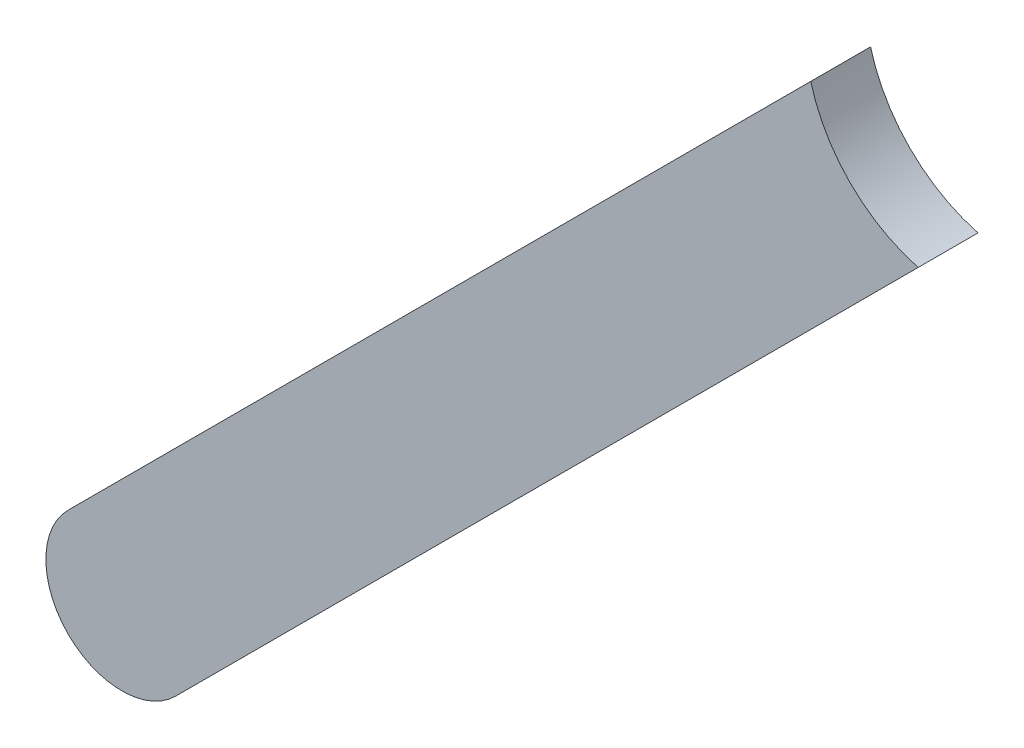
ISO-10303-21;
HEADER;
FILE_DESCRIPTION(('STEP AP214'),'2;1');
FILE_NAME('part.step','',(''),(''),'','','');
FILE_SCHEMA(('AUTOMOTIVE_DESIGN { 1 0 10303 214 1 1 1 1 }'));
ENDSEC;
DATA;
#1=APPLICATION_CONTEXT('core data for automotive mechanical design processes');
#2=APPLICATION_PROTOCOL_DEFINITION('international standard','automotive_design',2000,#1);
#3=PRODUCT_CONTEXT('',#1,'mechanical');
#4=PRODUCT('Part','Part','',(#3));
#5=PRODUCT_RELATED_PRODUCT_CATEGORY('part','',(#4));
#6=PRODUCT_DEFINITION_FORMATION('','',#4);
#7=PRODUCT_DEFINITION_CONTEXT('part definition',#1,'design');
#8=PRODUCT_DEFINITION('design','',#6,#7);
#9=PRODUCT_DEFINITION_SHAPE('','',#8);
#10=(LENGTH_UNIT() NAMED_UNIT(*) SI_UNIT(.MILLI.,.METRE.));
#11=(NAMED_UNIT(*) PLANE_ANGLE_UNIT() SI_UNIT($,.RADIAN.));
#12=(NAMED_UNIT(*) SI_UNIT($,.STERADIAN.) SOLID_ANGLE_UNIT());
#13=UNCERTAINTY_MEASURE_WITH_UNIT(LENGTH_MEASURE(1.E-05),#10,'distance_accuracy_value','');
#14=(GEOMETRIC_REPRESENTATION_CONTEXT(3) GLOBAL_UNCERTAINTY_ASSIGNED_CONTEXT((#13)) GLOBAL_UNIT_ASSIGNED_CONTEXT((#10,
#11,#12)) REPRESENTATION_CONTEXT('',''));
#15=CARTESIAN_POINT('',(0.,0.,0.));
#16=DIRECTION('',(0.,0.,1.));
#17=DIRECTION('',(1.,0.,0.));
#18=AXIS2_PLACEMENT_3D('',#15,#16,#17);
#19=CARTESIAN_POINT('',(87.55560594,87.7043966,0.));
#20=DIRECTION('',(-0.707106781186548,0.707106781186548,0.));
#21=DIRECTION('',(0.707106781186548,0.707106781186548,0.));
#22=AXIS2_PLACEMENT_3D('',#19,#20,#21);
#23=PLANE('',#22);
#24=DIRECTION('',(0.707106781186548,0.707106781186548,0.));
#25=VECTOR('',#24,1.);
#26=CARTESIAN_POINT('',(87.55560594,87.7043966,0.1999996));
#27=LINE('',#26,#25);
#28=CARTESIAN_POINT('',(87.55560594,87.7043966,0.1999996));
#29=VERTEX_POINT('',#28);
#30=CARTESIAN_POINT('',(90.0385192114614,90.1873098714614,0.1999996));
#31=VERTEX_POINT('',#30);
#32=EDGE_CURVE('E11',#29,#31,#27,.T.);
#33=ORIENTED_EDGE('',*,*,#32,.F.);
#34=DIRECTION('',(0.,0.,1.));
#35=VECTOR('',#34,1.);
#36=CARTESIAN_POINT('',(87.55560594,87.7043966,0.));
#37=LINE('',#36,#35);
#38=CARTESIAN_POINT('',(87.55560594,87.7043966,0.));
#39=VERTEX_POINT('',#38);
#40=EDGE_CURVE('E24',#39,#29,#37,.T.);
#41=ORIENTED_EDGE('',*,*,#40,.F.);
#42=DIRECTION('',(0.707106781186548,0.707106781186548,0.));
#43=VECTOR('',#42,1.);
#44=CARTESIAN_POINT('',(87.55560594,87.7043966,0.));
#45=LINE('',#44,#43);
#46=CARTESIAN_POINT('',(90.0385192114614,90.1873098714614,0.));
#47=VERTEX_POINT('',#46);
#48=EDGE_CURVE('E75',#39,#47,#45,.T.);
#49=ORIENTED_EDGE('',*,*,#48,.T.);
#50=DIRECTION('',(0.,0.,1.));
#51=VECTOR('',#50,1.);
#52=CARTESIAN_POINT('',(90.0385192114614,90.1873098714614,0.));
#53=LINE('',#52,#51);
#54=EDGE_CURVE('E37',#47,#31,#53,.T.);
#55=ORIENTED_EDGE('',*,*,#54,.T.);
#56=EDGE_LOOP('',(#33,#41,#49,#55));
#57=FACE_BOUND('',#56,.T.);
#58=ADVANCED_FACE('F17',(#57),#23,.F.);
#59=CARTESIAN_POINT('',(90.17,90.678,0.));
#60=DIRECTION('',(0.,0.,-1.));
#61=DIRECTION('',(1.,0.,0.));
#62=AXIS2_PLACEMENT_3D('',#59,#60,#61);
#63=CYLINDRICAL_SURFACE('',#62,0.508);
#64=DIRECTION('',(0.,0.,1.));
#65=VECTOR('',#64,1.);
#66=CARTESIAN_POINT('',(89.6793098714614,90.5465192114614,0.));
#67=LINE('',#66,#65);
#68=CARTESIAN_POINT('',(89.6793098714614,90.5465192114614,0.));
#69=VERTEX_POINT('',#68);
#70=CARTESIAN_POINT('',(89.6793098714614,90.5465192114614,0.1999996));
#71=VERTEX_POINT('',#70);
#72=EDGE_CURVE('E67',#69,#71,#67,.T.);
#73=ORIENTED_EDGE('',*,*,#72,.T.);
#74=CARTESIAN_POINT('',(90.17,90.678,0.1999996));
#75=DIRECTION('',(0.,0.,1.));
#76=DIRECTION('',(1.,0.,0.));
#77=AXIS2_PLACEMENT_3D('',#74,#75,#76);
#78=CIRCLE('',#77,0.508);
#79=EDGE_CURVE('E82',#71,#31,#78,.T.);
#80=ORIENTED_EDGE('',*,*,#79,.T.);
#81=ORIENTED_EDGE('',*,*,#54,.F.);
#82=CARTESIAN_POINT('',(90.17,90.678,0.));
#83=DIRECTION('',(0.,0.,1.));
#84=DIRECTION('',(1.,0.,0.));
#85=AXIS2_PLACEMENT_3D('',#82,#83,#84);
#86=CIRCLE('',#85,0.508);
#87=EDGE_CURVE('E80',#69,#47,#86,.T.);
#88=ORIENTED_EDGE('',*,*,#87,.F.);
#89=EDGE_LOOP('',(#73,#80,#81,#88));
#90=FACE_BOUND('',#89,.T.);
#91=ADVANCED_FACE('F88',(#90),#63,.F.);
#92=CARTESIAN_POINT('',(89.6793098714614,90.5465192114614,0.));
#93=DIRECTION('',(0.707106781186549,-0.707106781186546,0.));
#94=DIRECTION('',(-0.707106781186546,-0.707106781186549,0.));
#95=AXIS2_PLACEMENT_3D('',#92,#93,#94);
#96=PLANE('',#95);
#97=DIRECTION('',(-0.707106781186546,-0.707106781186549,0.));
#98=VECTOR('',#97,1.);
#99=CARTESIAN_POINT('',(89.99039406,90.8576034,0.1999996));
#100=LINE('',#99,#98);
#101=CARTESIAN_POINT('',(87.1963966,88.06360594,0.1999996));
#102=VERTEX_POINT('',#101);
#103=EDGE_CURVE('E71',#71,#102,#100,.T.);
#104=ORIENTED_EDGE('',*,*,#103,.F.);
#105=ORIENTED_EDGE('',*,*,#72,.F.);
#106=DIRECTION('',(-0.707106781186546,-0.707106781186549,0.));
#107=VECTOR('',#106,1.);
#108=CARTESIAN_POINT('',(89.99039406,90.8576034,0.));
#109=LINE('',#108,#107);
#110=CARTESIAN_POINT('',(87.1963966,88.06360594,0.));
#111=VERTEX_POINT('',#110);
#112=EDGE_CURVE('E63',#69,#111,#109,.T.);
#113=ORIENTED_EDGE('',*,*,#112,.T.);
#114=DIRECTION('',(0.,0.,1.));
#115=VECTOR('',#114,1.);
#116=CARTESIAN_POINT('',(87.1963966,88.06360594,0.));
#117=LINE('',#116,#115);
#118=EDGE_CURVE('E53',#111,#102,#117,.T.);
#119=ORIENTED_EDGE('',*,*,#118,.T.);
#120=EDGE_LOOP('',(#104,#105,#113,#119));
#121=FACE_BOUND('',#120,.T.);
#122=ADVANCED_FACE('F66',(#121),#96,.F.);
#123=CARTESIAN_POINT('',(87.37600127,87.88400127,0.));
#124=DIRECTION('',(0.,0.,-1.));
#125=DIRECTION('',(-0.707106781186548,0.707106781186548,0.));
#126=AXIS2_PLACEMENT_3D('',#123,#124,#125);
#127=CYLINDRICAL_SURFACE('',#126,0.253999360179539);
#128=CARTESIAN_POINT('',(87.37600127,87.88400127,0.1999996));
#129=DIRECTION('',(0.,0.,1.));
#130=DIRECTION('',(-0.707106781186548,0.707106781186548,0.));
#131=AXIS2_PLACEMENT_3D('',#128,#129,#130);
#132=CIRCLE('',#131,0.253999360179539);
#133=EDGE_CURVE('E59',#102,#29,#132,.T.);
#134=ORIENTED_EDGE('',*,*,#133,.F.);
#135=ORIENTED_EDGE('',*,*,#118,.F.);
#136=CARTESIAN_POINT('',(87.37600127,87.88400127,0.));
#137=DIRECTION('',(0.,0.,1.));
#138=DIRECTION('',(-0.707106781186548,0.707106781186548,0.));
#139=AXIS2_PLACEMENT_3D('',#136,#137,#138);
#140=CIRCLE('',#139,0.253999360179539);
#141=EDGE_CURVE('E57',#111,#39,#140,.T.);
#142=ORIENTED_EDGE('',*,*,#141,.T.);
#143=ORIENTED_EDGE('',*,*,#40,.T.);
#144=EDGE_LOOP('',(#134,#135,#142,#143));
#145=FACE_BOUND('',#144,.T.);
#146=ADVANCED_FACE('F55',(#145),#127,.T.);
#147=CARTESIAN_POINT('',(87.55560594,87.7043966,0.));
#148=DIRECTION('',(0.,0.,-1.));
#149=DIRECTION('',(-1.,0.,0.));
#150=AXIS2_PLACEMENT_3D('',#147,#148,#149);
#151=PLANE('',#150);
#152=ORIENTED_EDGE('',*,*,#48,.F.);
#153=ORIENTED_EDGE('',*,*,#141,.F.);
#154=ORIENTED_EDGE('',*,*,#112,.F.);
#155=ORIENTED_EDGE('',*,*,#87,.T.);
#156=EDGE_LOOP('',(#152,#153,#154,#155));
#157=FACE_BOUND('',#156,.T.);
#158=ADVANCED_FACE('F74',(#157),#151,.T.);
#159=CARTESIAN_POINT('',(87.55560594,87.7043966,0.1999996));
#160=DIRECTION('',(0.,0.,-1.));
#161=DIRECTION('',(-1.,0.,0.));
#162=AXIS2_PLACEMENT_3D('',#159,#160,#161);
#163=PLANE('',#162);
#164=ORIENTED_EDGE('',*,*,#133,.T.);
#165=ORIENTED_EDGE('',*,*,#32,.T.);
#166=ORIENTED_EDGE('',*,*,#79,.F.);
#167=ORIENTED_EDGE('',*,*,#103,.T.);
#168=EDGE_LOOP('',(#164,#165,#166,#167));
#169=FACE_BOUND('',#168,.T.);
#170=ADVANCED_FACE('F91',(#169),#163,.F.);
#171=CLOSED_SHELL('',(#58,#91,#122,#146,#158,#170));
#172=MANIFOLD_SOLID_BREP('B1',#171);
#173=ADVANCED_BREP_SHAPE_REPRESENTATION('',(#18,#172),#14);
#174=SHAPE_DEFINITION_REPRESENTATION(#9,#173);
ENDSEC;
END-ISO-10303-21;
